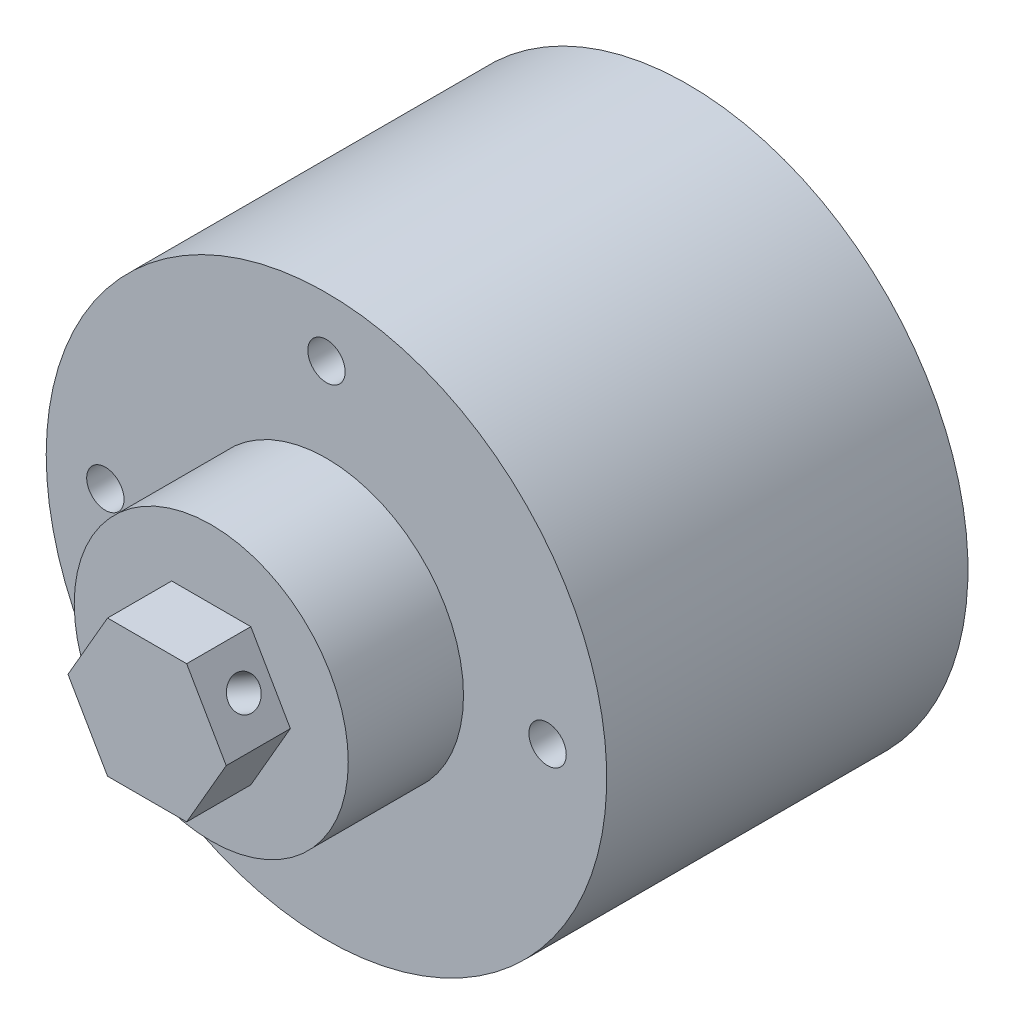
ISO-10303-21;
HEADER;
FILE_DESCRIPTION(('STEP AP214'),'2;1');
FILE_NAME('part.step','',(''),(''),'','','');
FILE_SCHEMA(('AUTOMOTIVE_DESIGN { 1 0 10303 214 1 1 1 1 }'));
ENDSEC;
DATA;
#1=APPLICATION_CONTEXT('core data for automotive mechanical design processes');
#2=APPLICATION_PROTOCOL_DEFINITION('international standard','automotive_design',2000,#1);
#3=PRODUCT_CONTEXT('',#1,'mechanical');
#4=PRODUCT('Part','Part','',(#3));
#5=PRODUCT_RELATED_PRODUCT_CATEGORY('part','',(#4));
#6=PRODUCT_DEFINITION_FORMATION('','',#4);
#7=PRODUCT_DEFINITION_CONTEXT('part definition',#1,'design');
#8=PRODUCT_DEFINITION('design','',#6,#7);
#9=PRODUCT_DEFINITION_SHAPE('','',#8);
#10=(LENGTH_UNIT() NAMED_UNIT(*) SI_UNIT(.MILLI.,.METRE.));
#11=(NAMED_UNIT(*) PLANE_ANGLE_UNIT() SI_UNIT($,.RADIAN.));
#12=(NAMED_UNIT(*) SI_UNIT($,.STERADIAN.) SOLID_ANGLE_UNIT());
#13=UNCERTAINTY_MEASURE_WITH_UNIT(LENGTH_MEASURE(1.E-05),#10,'distance_accuracy_value','');
#14=(GEOMETRIC_REPRESENTATION_CONTEXT(3) GLOBAL_UNCERTAINTY_ASSIGNED_CONTEXT((#13)) GLOBAL_UNIT_ASSIGNED_CONTEXT((#10,
#11,#12)) REPRESENTATION_CONTEXT('',''));
#15=CARTESIAN_POINT('',(0.,0.,0.));
#16=DIRECTION('',(0.,0.,1.));
#17=DIRECTION('',(1.,0.,0.));
#18=AXIS2_PLACEMENT_3D('',#15,#16,#17);
#19=CARTESIAN_POINT('',(0.,0.,58.));
#20=DIRECTION('',(0.,0.,-1.));
#21=DIRECTION('',(-1.,0.,0.));
#22=AXIS2_PLACEMENT_3D('',#19,#20,#21);
#23=CYLINDRICAL_SURFACE('',#22,45.);
#24=CARTESIAN_POINT('',(0.,0.,58.));
#25=DIRECTION('',(0.,0.,1.));
#26=DIRECTION('',(1.,0.,0.));
#27=AXIS2_PLACEMENT_3D('',#24,#25,#26);
#28=CIRCLE('',#27,45.);
#29=CARTESIAN_POINT('',(-45.,0.,58.));
#30=VERTEX_POINT('',#29);
#31=EDGE_CURVE('E54',#30,#30,#28,.T.);
#32=CARTESIAN_POINT('',(0.,0.,0.));
#33=DIRECTION('',(0.,0.,1.));
#34=DIRECTION('',(1.,0.,0.));
#35=AXIS2_PLACEMENT_3D('',#32,#33,#34);
#36=CIRCLE('',#35,45.);
#37=CARTESIAN_POINT('',(-45.,0.,0.));
#38=VERTEX_POINT('',#37);
#39=EDGE_CURVE('E128',#38,#38,#36,.T.);
#40=CARTESIAN_POINT('',(-45.,0.,58.));
#41=CARTESIAN_POINT('',(-45.,0.,57.3958333333333));
#42=CARTESIAN_POINT('',(-45.,0.,56.7916666666667));
#43=CARTESIAN_POINT('',(-45.,0.,55.5833333333333));
#44=CARTESIAN_POINT('',(-45.,0.,54.9791666666667));
#45=CARTESIAN_POINT('',(-45.,0.,53.7708333333333));
#46=CARTESIAN_POINT('',(-45.,0.,53.1666666666667));
#47=CARTESIAN_POINT('',(-45.,0.,51.9583333333333));
#48=CARTESIAN_POINT('',(-45.,0.,51.3541666666667));
#49=CARTESIAN_POINT('',(-45.,0.,50.1458333333333));
#50=CARTESIAN_POINT('',(-45.,0.,49.5416666666667));
#51=CARTESIAN_POINT('',(-45.,0.,48.3333333333333));
#52=CARTESIAN_POINT('',(-45.,0.,47.7291666666667));
#53=CARTESIAN_POINT('',(-45.,0.,46.5208333333333));
#54=CARTESIAN_POINT('',(-45.,0.,45.9166666666667));
#55=CARTESIAN_POINT('',(-45.,0.,44.7083333333333));
#56=CARTESIAN_POINT('',(-45.,0.,44.1041666666667));
#57=CARTESIAN_POINT('',(-45.,0.,42.8958333333333));
#58=CARTESIAN_POINT('',(-45.,0.,42.2916666666667));
#59=CARTESIAN_POINT('',(-45.,0.,41.0833333333333));
#60=CARTESIAN_POINT('',(-45.,0.,40.4791666666667));
#61=CARTESIAN_POINT('',(-45.,0.,39.2708333333333));
#62=CARTESIAN_POINT('',(-45.,0.,38.6666666666667));
#63=CARTESIAN_POINT('',(-45.,0.,37.4583333333333));
#64=CARTESIAN_POINT('',(-45.,0.,36.8541666666667));
#65=CARTESIAN_POINT('',(-45.,0.,35.6458333333333));
#66=CARTESIAN_POINT('',(-45.,0.,35.0416666666667));
#67=CARTESIAN_POINT('',(-45.,0.,33.8333333333333));
#68=CARTESIAN_POINT('',(-45.,0.,33.2291666666667));
#69=CARTESIAN_POINT('',(-45.,0.,32.0208333333333));
#70=CARTESIAN_POINT('',(-45.,0.,31.4166666666667));
#71=CARTESIAN_POINT('',(-45.,0.,30.2083333333333));
#72=CARTESIAN_POINT('',(-45.,0.,29.6041666666667));
#73=CARTESIAN_POINT('',(-45.,0.,28.3958333333333));
#74=CARTESIAN_POINT('',(-45.,0.,27.7916666666667));
#75=CARTESIAN_POINT('',(-45.,0.,26.5833333333333));
#76=CARTESIAN_POINT('',(-45.,0.,25.9791666666667));
#77=CARTESIAN_POINT('',(-45.,0.,24.7708333333333));
#78=CARTESIAN_POINT('',(-45.,0.,24.1666666666667));
#79=CARTESIAN_POINT('',(-45.,0.,22.9583333333333));
#80=CARTESIAN_POINT('',(-45.,0.,22.3541666666667));
#81=CARTESIAN_POINT('',(-45.,0.,21.1458333333333));
#82=CARTESIAN_POINT('',(-45.,0.,20.5416666666667));
#83=CARTESIAN_POINT('',(-45.,0.,19.3333333333333));
#84=CARTESIAN_POINT('',(-45.,0.,18.7291666666667));
#85=CARTESIAN_POINT('',(-45.,0.,17.5208333333333));
#86=CARTESIAN_POINT('',(-45.,0.,16.9166666666667));
#87=CARTESIAN_POINT('',(-45.,0.,15.7083333333333));
#88=CARTESIAN_POINT('',(-45.,0.,15.1041666666667));
#89=CARTESIAN_POINT('',(-45.,0.,13.8958333333333));
#90=CARTESIAN_POINT('',(-45.,0.,13.2916666666667));
#91=CARTESIAN_POINT('',(-45.,0.,12.0833333333333));
#92=CARTESIAN_POINT('',(-45.,0.,11.4791666666667));
#93=CARTESIAN_POINT('',(-45.,0.,10.2708333333333));
#94=CARTESIAN_POINT('',(-45.,0.,9.66666666666667));
#95=CARTESIAN_POINT('',(-45.,0.,8.45833333333333));
#96=CARTESIAN_POINT('',(-45.,0.,7.85416666666667));
#97=CARTESIAN_POINT('',(-45.,0.,6.64583333333333));
#98=CARTESIAN_POINT('',(-45.,0.,6.04166666666667));
#99=CARTESIAN_POINT('',(-45.,0.,4.83333333333333));
#100=CARTESIAN_POINT('',(-45.,0.,4.22916666666667));
#101=CARTESIAN_POINT('',(-45.,0.,3.02083333333334));
#102=CARTESIAN_POINT('',(-45.,0.,2.41666666666667));
#103=CARTESIAN_POINT('',(-45.,0.,1.20833333333333));
#104=CARTESIAN_POINT('',(-45.,0.,0.604166666666666));
#105=CARTESIAN_POINT('',(-45.,0.,0.));
#106=B_SPLINE_CURVE_WITH_KNOTS('',3,(#40,#41,#42,#43,#44,#45,#46,#47,#48,#49,#50,#51,#52,#53,
#54,#55,#56,#57,#58,#59,#60,#61,#62,#63,#64,#65,#66,#67,#68,#69,#70,#71,#72,#73,#74,#75,#76,#77,
#78,#79,#80,#81,#82,#83,#84,#85,#86,#87,#88,#89,#90,#91,#92,#93,#94,#95,#96,#97,#98,#99,#100,
#101,#102,#103,#104,#105),.UNSPECIFIED.,.F.,.F.,(4,2,2,2,2,2,2,2,2,2,2,2,2,2,2,2,2,2,2,2,2,2,2,
2,2,2,2,2,2,2,2,2,4),(0.,1.81249999999999,3.625,5.4375,7.24999999999999,9.06249999999999,10.875,
12.6875,14.5,16.3125,18.125,19.9375,21.75,23.5625,25.375,27.1875,29.,30.8125,32.625,34.4375,
36.25,38.0625,39.875,41.6875,43.5,45.3125,47.125,48.9375,50.75,52.5625,54.375,56.1875,58.),.UNSPECIFIED.);
#107=EDGE_CURVE('BSEAM45',#30,#38,#106,.T.);
#108=ORIENTED_EDGE('',*,*,#31,.F.);
#109=ORIENTED_EDGE('',*,*,#39,.T.);
#110=ORIENTED_EDGE('',*,*,#107,.T.);
#111=ORIENTED_EDGE('',*,*,#107,.F.);
#112=EDGE_LOOP('',(#108,#110,#109,#111));
#113=FACE_BOUND('',#112,.T.);
#114=ADVANCED_FACE('F45',(#113),#23,.T.);
#115=CARTESIAN_POINT('',(0.,0.,58.));
#116=DIRECTION('',(0.,0.,1.));
#117=DIRECTION('',(1.,0.,0.));
#118=AXIS2_PLACEMENT_3D('',#115,#116,#117);
#119=PLANE('',#118);
#120=CARTESIAN_POINT('',(-35.5,0.,58.));
#121=DIRECTION('',(0.,0.,1.));
#122=DIRECTION('',(1.,0.,0.));
#123=AXIS2_PLACEMENT_3D('',#120,#121,#122);
#124=CIRCLE('',#123,3.);
#125=CARTESIAN_POINT('',(-32.5,0.,58.));
#126=VERTEX_POINT('',#125);
#127=EDGE_CURVE('E328',#126,#126,#124,.T.);
#128=ORIENTED_EDGE('',*,*,#127,.F.);
#129=EDGE_LOOP('',(#128));
#130=FACE_BOUND('',#129,.T.);
#131=CARTESIAN_POINT('',(35.5,0.,58.));
#132=DIRECTION('',(0.,0.,1.));
#133=DIRECTION('',(1.,0.,0.));
#134=AXIS2_PLACEMENT_3D('',#131,#132,#133);
#135=CIRCLE('',#134,3.);
#136=CARTESIAN_POINT('',(38.5,0.,58.));
#137=VERTEX_POINT('',#136);
#138=EDGE_CURVE('E335',#137,#137,#135,.T.);
#139=ORIENTED_EDGE('',*,*,#138,.F.);
#140=EDGE_LOOP('',(#139));
#141=FACE_BOUND('',#140,.T.);
#142=CARTESIAN_POINT('',(0.,35.5,58.));
#143=DIRECTION('',(0.,0.,1.));
#144=DIRECTION('',(1.,0.,0.));
#145=AXIS2_PLACEMENT_3D('',#142,#143,#144);
#146=CIRCLE('',#145,3.);
#147=CARTESIAN_POINT('',(3.,35.5,58.));
#148=VERTEX_POINT('',#147);
#149=EDGE_CURVE('E345',#148,#148,#146,.T.);
#150=ORIENTED_EDGE('',*,*,#149,.F.);
#151=EDGE_LOOP('',(#150));
#152=FACE_BOUND('',#151,.T.);
#153=CARTESIAN_POINT('',(0.,0.,58.));
#154=DIRECTION('',(0.,0.,1.));
#155=DIRECTION('',(1.,0.,0.));
#156=AXIS2_PLACEMENT_3D('',#153,#154,#155);
#157=CIRCLE('',#156,22.);
#158=CARTESIAN_POINT('',(22.,0.,58.));
#159=VERTEX_POINT('',#158);
#160=EDGE_CURVE('E11',#159,#159,#157,.T.);
#161=ORIENTED_EDGE('',*,*,#160,.F.);
#162=EDGE_LOOP('',(#161));
#163=FACE_BOUND('',#162,.T.);
#164=ORIENTED_EDGE('',*,*,#31,.T.);
#165=EDGE_LOOP('',(#164));
#166=FACE_BOUND('',#165,.T.);
#167=ADVANCED_FACE('F144',(#130,#141,#152,#163,#166),#119,.T.);
#168=CARTESIAN_POINT('',(0.,0.,0.));
#169=DIRECTION('',(0.,0.,1.));
#170=DIRECTION('',(1.,0.,0.));
#171=AXIS2_PLACEMENT_3D('',#168,#169,#170);
#172=PLANE('',#171);
#173=ORIENTED_EDGE('',*,*,#39,.F.);
#174=EDGE_LOOP('',(#173));
#175=FACE_BOUND('',#174,.T.);
#176=ADVANCED_FACE('F141',(#175),#172,.F.);
#177=CARTESIAN_POINT('',(0.,0.,76.5));
#178=DIRECTION('',(0.,0.,-1.));
#179=DIRECTION('',(-1.,0.,0.));
#180=AXIS2_PLACEMENT_3D('',#177,#178,#179);
#181=CYLINDRICAL_SURFACE('',#180,22.);
#182=CARTESIAN_POINT('',(0.,0.,76.5));
#183=DIRECTION('',(0.,0.,1.));
#184=DIRECTION('',(1.,0.,0.));
#185=AXIS2_PLACEMENT_3D('',#182,#183,#184);
#186=CIRCLE('',#185,22.);
#187=CARTESIAN_POINT('',(22.,0.,76.5));
#188=VERTEX_POINT('',#187);
#189=EDGE_CURVE('E123',#188,#188,#186,.T.);
#190=ORIENTED_EDGE('',*,*,#189,.F.);
#191=EDGE_LOOP('',(#190));
#192=FACE_BOUND('',#191,.T.);
#193=ORIENTED_EDGE('',*,*,#160,.T.);
#194=EDGE_LOOP('',(#193));
#195=FACE_BOUND('',#194,.T.);
#196=ADVANCED_FACE('F143',(#192,#195),#181,.T.);
#197=CARTESIAN_POINT('',(0.,0.,76.5));
#198=DIRECTION('',(0.,0.,1.));
#199=DIRECTION('',(1.,0.,0.));
#200=AXIS2_PLACEMENT_3D('',#197,#198,#199);
#201=PLANE('',#200);
#202=DIRECTION('',(0.5,0.866025403784439,0.));
#203=VECTOR('',#202,1.);
#204=CARTESIAN_POINT('',(6.35085296108589,-11.,76.5));
#205=LINE('',#204,#203);
#206=CARTESIAN_POINT('',(6.35085296108589,-11.,76.5));
#207=VERTEX_POINT('',#206);
#208=CARTESIAN_POINT('',(12.7017059221718,0.,76.5));
#209=VERTEX_POINT('',#208);
#210=EDGE_CURVE('E62',#207,#209,#205,.T.);
#211=ORIENTED_EDGE('',*,*,#210,.F.);
#212=DIRECTION('',(1.,0.,0.));
#213=VECTOR('',#212,1.);
#214=CARTESIAN_POINT('',(-6.35085296108588,-11.,76.5));
#215=LINE('',#214,#213);
#216=CARTESIAN_POINT('',(-6.35085296108588,-11.,76.5));
#217=VERTEX_POINT('',#216);
#218=EDGE_CURVE('E66',#217,#207,#215,.T.);
#219=ORIENTED_EDGE('',*,*,#218,.F.);
#220=DIRECTION('',(0.5,-0.866025403784438,0.));
#221=VECTOR('',#220,1.);
#222=CARTESIAN_POINT('',(-12.7017059221718,0.,76.5));
#223=LINE('',#222,#221);
#224=CARTESIAN_POINT('',(-12.7017059221718,0.,76.5));
#225=VERTEX_POINT('',#224);
#226=EDGE_CURVE('E377',#225,#217,#223,.T.);
#227=ORIENTED_EDGE('',*,*,#226,.F.);
#228=DIRECTION('',(-0.5,-0.866025403784439,0.));
#229=VECTOR('',#228,1.);
#230=CARTESIAN_POINT('',(-6.35085296108588,11.,76.5));
#231=LINE('',#230,#229);
#232=CARTESIAN_POINT('',(-6.35085296108588,11.,76.5));
#233=VERTEX_POINT('',#232);
#234=EDGE_CURVE('E373',#233,#225,#231,.T.);
#235=ORIENTED_EDGE('',*,*,#234,.F.);
#236=DIRECTION('',(-1.,0.,0.));
#237=VECTOR('',#236,1.);
#238=CARTESIAN_POINT('',(6.35085296108588,11.,76.5));
#239=LINE('',#238,#237);
#240=CARTESIAN_POINT('',(6.35085296108588,11.,76.5));
#241=VERTEX_POINT('',#240);
#242=EDGE_CURVE('E369',#241,#233,#239,.T.);
#243=ORIENTED_EDGE('',*,*,#242,.F.);
#244=DIRECTION('',(-0.5,0.866025403784438,0.));
#245=VECTOR('',#244,1.);
#246=CARTESIAN_POINT('',(12.7017059221718,0.,76.5));
#247=LINE('',#246,#245);
#248=EDGE_CURVE('E366',#209,#241,#247,.T.);
#249=ORIENTED_EDGE('',*,*,#248,.F.);
#250=EDGE_LOOP('',(#211,#219,#227,#235,#243,#249));
#251=FACE_BOUND('',#250,.T.);
#252=ORIENTED_EDGE('',*,*,#189,.T.);
#253=EDGE_LOOP('',(#252));
#254=FACE_BOUND('',#253,.T.);
#255=ADVANCED_FACE('F149',(#251,#254),#201,.T.);
#256=CARTESIAN_POINT('',(6.35085296108589,-11.,86.8));
#257=DIRECTION('',(-0.866025403784439,0.5,0.));
#258=DIRECTION('',(-0.5,-0.866025403784439,0.));
#259=AXIS2_PLACEMENT_3D('',#256,#257,#258);
#260=PLANE('',#259);
#261=ORIENTED_EDGE('',*,*,#210,.T.);
#262=DIRECTION('',(0.,0.,-1.));
#263=VECTOR('',#262,1.);
#264=CARTESIAN_POINT('',(12.7017059221718,0.,86.8));
#265=LINE('',#264,#263);
#266=CARTESIAN_POINT('',(12.7017059221718,0.,86.8));
#267=VERTEX_POINT('',#266);
#268=EDGE_CURVE('E103',#267,#209,#265,.T.);
#269=ORIENTED_EDGE('',*,*,#268,.F.);
#270=DIRECTION('',(0.5,0.866025403784439,0.));
#271=VECTOR('',#270,1.);
#272=CARTESIAN_POINT('',(6.35085296108589,-11.,86.8));
#273=LINE('',#272,#271);
#274=CARTESIAN_POINT('',(6.35085296108589,-11.,86.8));
#275=VERTEX_POINT('',#274);
#276=EDGE_CURVE('E110',#275,#267,#273,.T.);
#277=ORIENTED_EDGE('',*,*,#276,.F.);
#278=DIRECTION('',(0.,0.,-1.));
#279=VECTOR('',#278,1.);
#280=CARTESIAN_POINT('',(6.35085296108589,-11.,86.8));
#281=LINE('',#280,#279);
#282=EDGE_CURVE('E363',#275,#207,#281,.T.);
#283=ORIENTED_EDGE('',*,*,#282,.T.);
#284=EDGE_LOOP('',(#261,#269,#277,#283));
#285=FACE_BOUND('',#284,.T.);
#286=ADVANCED_FACE('F121',(#285),#260,.F.);
#287=CARTESIAN_POINT('',(12.7017059221718,0.,86.8));
#288=DIRECTION('',(-0.866025403784438,-0.5,0.));
#289=DIRECTION('',(0.5,-0.866025403784439,0.));
#290=AXIS2_PLACEMENT_3D('',#287,#288,#289);
#291=PLANE('',#290);
#292=CARTESIAN_POINT('',(9.52627944162883,5.50000000000001,80.8));
#293=DIRECTION('',(0.866025403784438,0.5,0.));
#294=DIRECTION('',(-0.5,0.866025403784439,0.));
#295=AXIS2_PLACEMENT_3D('',#292,#293,#294);
#296=CIRCLE('',#295,2.49999999999999);
#297=CARTESIAN_POINT('',(8.27627944162883,7.6650635094611,80.8));
#298=VERTEX_POINT('',#297);
#299=EDGE_CURVE('E327',#298,#298,#296,.T.);
#300=ORIENTED_EDGE('',*,*,#299,.F.);
#301=EDGE_LOOP('',(#300));
#302=FACE_BOUND('',#301,.T.);
#303=ORIENTED_EDGE('',*,*,#248,.T.);
#304=DIRECTION('',(0.,0.,-1.));
#305=VECTOR('',#304,1.);
#306=CARTESIAN_POINT('',(6.35085296108588,11.,86.8));
#307=LINE('',#306,#305);
#308=CARTESIAN_POINT('',(6.35085296108588,11.,86.8));
#309=VERTEX_POINT('',#308);
#310=EDGE_CURVE('E105',#309,#241,#307,.T.);
#311=ORIENTED_EDGE('',*,*,#310,.F.);
#312=DIRECTION('',(-0.5,0.866025403784438,0.));
#313=VECTOR('',#312,1.);
#314=CARTESIAN_POINT('',(12.7017059221718,0.,86.8));
#315=LINE('',#314,#313);
#316=EDGE_CURVE('E98',#267,#309,#315,.T.);
#317=ORIENTED_EDGE('',*,*,#316,.F.);
#318=ORIENTED_EDGE('',*,*,#268,.T.);
#319=EDGE_LOOP('',(#303,#311,#317,#318));
#320=FACE_BOUND('',#319,.T.);
#321=ADVANCED_FACE('F101',(#302,#320),#291,.F.);
#322=CARTESIAN_POINT('',(6.35085296108588,11.,86.8));
#323=DIRECTION('',(0.,-1.,0.));
#324=DIRECTION('',(0.,0.,-1.));
#325=AXIS2_PLACEMENT_3D('',#322,#323,#324);
#326=PLANE('',#325);
#327=ORIENTED_EDGE('',*,*,#242,.T.);
#328=DIRECTION('',(0.,0.,-1.));
#329=VECTOR('',#328,1.);
#330=CARTESIAN_POINT('',(-6.35085296108588,11.,86.8));
#331=LINE('',#330,#329);
#332=CARTESIAN_POINT('',(-6.35085296108588,11.,86.8));
#333=VERTEX_POINT('',#332);
#334=EDGE_CURVE('E130',#333,#233,#331,.T.);
#335=ORIENTED_EDGE('',*,*,#334,.F.);
#336=DIRECTION('',(-1.,0.,0.));
#337=VECTOR('',#336,1.);
#338=CARTESIAN_POINT('',(6.35085296108588,11.,86.8));
#339=LINE('',#338,#337);
#340=EDGE_CURVE('E109',#309,#333,#339,.T.);
#341=ORIENTED_EDGE('',*,*,#340,.F.);
#342=ORIENTED_EDGE('',*,*,#310,.T.);
#343=EDGE_LOOP('',(#327,#335,#341,#342));
#344=FACE_BOUND('',#343,.T.);
#345=ADVANCED_FACE('F205',(#344),#326,.F.);
#346=CARTESIAN_POINT('',(-6.35085296108588,11.,86.8));
#347=DIRECTION('',(0.866025403784439,-0.5,0.));
#348=DIRECTION('',(0.5,0.866025403784439,0.));
#349=AXIS2_PLACEMENT_3D('',#346,#347,#348);
#350=PLANE('',#349);
#351=ORIENTED_EDGE('',*,*,#234,.T.);
#352=DIRECTION('',(0.,0.,-1.));
#353=VECTOR('',#352,1.);
#354=CARTESIAN_POINT('',(-12.7017059221718,0.,86.8));
#355=LINE('',#354,#353);
#356=CARTESIAN_POINT('',(-12.7017059221718,0.,86.8));
#357=VERTEX_POINT('',#356);
#358=EDGE_CURVE('E388',#357,#225,#355,.T.);
#359=ORIENTED_EDGE('',*,*,#358,.F.);
#360=DIRECTION('',(-0.5,-0.866025403784439,0.));
#361=VECTOR('',#360,1.);
#362=CARTESIAN_POINT('',(-6.35085296108588,11.,86.8));
#363=LINE('',#362,#361);
#364=EDGE_CURVE('E355',#333,#357,#363,.T.);
#365=ORIENTED_EDGE('',*,*,#364,.F.);
#366=ORIENTED_EDGE('',*,*,#334,.T.);
#367=EDGE_LOOP('',(#351,#359,#365,#366));
#368=FACE_BOUND('',#367,.T.);
#369=ADVANCED_FACE('F216',(#368),#350,.F.);
#370=CARTESIAN_POINT('',(-12.7017059221718,0.,86.8));
#371=DIRECTION('',(0.866025403784439,0.5,0.));
#372=DIRECTION('',(-0.5,0.866025403784438,0.));
#373=AXIS2_PLACEMENT_3D('',#370,#371,#372);
#374=PLANE('',#373);
#375=CARTESIAN_POINT('',(-9.52627944162882,-5.5,80.8));
#376=DIRECTION('',(0.866025403784439,0.5,0.));
#377=DIRECTION('',(-0.5,0.866025403784438,0.));
#378=AXIS2_PLACEMENT_3D('',#375,#376,#377);
#379=CIRCLE('',#378,2.49999999999999);
#380=CARTESIAN_POINT('',(-10.7762794416288,-3.33493649053891,80.8));
#381=VERTEX_POINT('',#380);
#382=EDGE_CURVE('E48',#381,#381,#379,.T.);
#383=ORIENTED_EDGE('',*,*,#382,.T.);
#384=EDGE_LOOP('',(#383));
#385=FACE_BOUND('',#384,.T.);
#386=ORIENTED_EDGE('',*,*,#226,.T.);
#387=DIRECTION('',(0.,0.,-1.));
#388=VECTOR('',#387,1.);
#389=CARTESIAN_POINT('',(-6.35085296108588,-11.,86.8));
#390=LINE('',#389,#388);
#391=CARTESIAN_POINT('',(-6.35085296108588,-11.,86.8));
#392=VERTEX_POINT('',#391);
#393=EDGE_CURVE('E384',#392,#217,#390,.T.);
#394=ORIENTED_EDGE('',*,*,#393,.F.);
#395=DIRECTION('',(0.5,-0.866025403784438,0.));
#396=VECTOR('',#395,1.);
#397=CARTESIAN_POINT('',(-12.7017059221718,0.,86.8));
#398=LINE('',#397,#396);
#399=EDGE_CURVE('E358',#357,#392,#398,.T.);
#400=ORIENTED_EDGE('',*,*,#399,.F.);
#401=ORIENTED_EDGE('',*,*,#358,.T.);
#402=EDGE_LOOP('',(#386,#394,#400,#401));
#403=FACE_BOUND('',#402,.T.);
#404=ADVANCED_FACE('F226',(#385,#403),#374,.F.);
#405=CARTESIAN_POINT('',(-6.35085296108588,-11.,86.8));
#406=DIRECTION('',(0.,1.,0.));
#407=DIRECTION('',(-1.,0.,0.));
#408=AXIS2_PLACEMENT_3D('',#405,#406,#407);
#409=PLANE('',#408);
#410=ORIENTED_EDGE('',*,*,#218,.T.);
#411=ORIENTED_EDGE('',*,*,#282,.F.);
#412=DIRECTION('',(1.,0.,0.));
#413=VECTOR('',#412,1.);
#414=CARTESIAN_POINT('',(-6.35085296108588,-11.,86.8));
#415=LINE('',#414,#413);
#416=EDGE_CURVE('E115',#392,#275,#415,.T.);
#417=ORIENTED_EDGE('',*,*,#416,.F.);
#418=ORIENTED_EDGE('',*,*,#393,.T.);
#419=EDGE_LOOP('',(#410,#411,#417,#418));
#420=FACE_BOUND('',#419,.T.);
#421=ADVANCED_FACE('F236',(#420),#409,.F.);
#422=CARTESIAN_POINT('',(0.,0.,86.8));
#423=DIRECTION('',(0.,0.,1.));
#424=DIRECTION('',(1.,0.,0.));
#425=AXIS2_PLACEMENT_3D('',#422,#423,#424);
#426=PLANE('',#425);
#427=ORIENTED_EDGE('',*,*,#276,.T.);
#428=ORIENTED_EDGE('',*,*,#316,.T.);
#429=ORIENTED_EDGE('',*,*,#340,.T.);
#430=ORIENTED_EDGE('',*,*,#364,.T.);
#431=ORIENTED_EDGE('',*,*,#399,.T.);
#432=ORIENTED_EDGE('',*,*,#416,.T.);
#433=EDGE_LOOP('',(#427,#428,#429,#430,#431,#432));
#434=FACE_BOUND('',#433,.T.);
#435=ADVANCED_FACE('F113',(#434),#426,.T.);
#436=CARTESIAN_POINT('',(-53.2355715851499,-30.7355715851499,80.8));
#437=DIRECTION('',(0.866025403784438,0.5,0.));
#438=DIRECTION('',(-0.5,0.866025403784438,0.));
#439=AXIS2_PLACEMENT_3D('',#436,#437,#438);
#440=CYLINDRICAL_SURFACE('',#439,2.49999999999999);
#441=ORIENTED_EDGE('',*,*,#299,.T.);
#442=EDGE_LOOP('',(#441));
#443=FACE_BOUND('',#442,.T.);
#444=ORIENTED_EDGE('',*,*,#382,.F.);
#445=EDGE_LOOP('',(#444));
#446=FACE_BOUND('',#445,.T.);
#447=ADVANCED_FACE('F253',(#443,#446),#440,.F.);
#448=CARTESIAN_POINT('',(0.,35.5,48.));
#449=DIRECTION('',(0.,0.,1.));
#450=DIRECTION('',(1.,0.,0.));
#451=AXIS2_PLACEMENT_3D('',#448,#449,#450);
#452=CYLINDRICAL_SURFACE('',#451,3.);
#453=CARTESIAN_POINT('',(0.,35.5,48.));
#454=DIRECTION('',(0.,0.,1.));
#455=DIRECTION('',(1.,0.,0.));
#456=AXIS2_PLACEMENT_3D('',#453,#454,#455);
#457=CIRCLE('',#456,3.);
#458=CARTESIAN_POINT('',(3.,35.5,48.));
#459=VERTEX_POINT('',#458);
#460=EDGE_CURVE('E349',#459,#459,#457,.T.);
#461=ORIENTED_EDGE('',*,*,#460,.F.);
#462=EDGE_LOOP('',(#461));
#463=FACE_BOUND('',#462,.T.);
#464=ORIENTED_EDGE('',*,*,#149,.T.);
#465=EDGE_LOOP('',(#464));
#466=FACE_BOUND('',#465,.T.);
#467=ADVANCED_FACE('F261',(#463,#466),#452,.F.);
#468=CARTESIAN_POINT('',(0.,35.5,48.));
#469=DIRECTION('',(0.,0.,1.));
#470=DIRECTION('',(1.,0.,0.));
#471=AXIS2_PLACEMENT_3D('',#468,#469,#470);
#472=PLANE('',#471);
#473=ORIENTED_EDGE('',*,*,#460,.T.);
#474=EDGE_LOOP('',(#473));
#475=FACE_BOUND('',#474,.T.);
#476=ADVANCED_FACE('F270',(#475),#472,.T.);
#477=CARTESIAN_POINT('',(35.5,0.,48.));
#478=DIRECTION('',(0.,0.,1.));
#479=DIRECTION('',(1.,0.,0.));
#480=AXIS2_PLACEMENT_3D('',#477,#478,#479);
#481=CYLINDRICAL_SURFACE('',#480,3.);
#482=CARTESIAN_POINT('',(35.5,0.,48.));
#483=DIRECTION('',(0.,0.,1.));
#484=DIRECTION('',(1.,0.,0.));
#485=AXIS2_PLACEMENT_3D('',#482,#483,#484);
#486=CIRCLE('',#485,3.);
#487=CARTESIAN_POINT('',(38.5,0.,48.));
#488=VERTEX_POINT('',#487);
#489=EDGE_CURVE('E341',#488,#488,#486,.T.);
#490=ORIENTED_EDGE('',*,*,#489,.F.);
#491=EDGE_LOOP('',(#490));
#492=FACE_BOUND('',#491,.T.);
#493=ORIENTED_EDGE('',*,*,#138,.T.);
#494=EDGE_LOOP('',(#493));
#495=FACE_BOUND('',#494,.T.);
#496=ADVANCED_FACE('F280',(#492,#495),#481,.F.);
#497=CARTESIAN_POINT('',(35.5,0.,48.));
#498=DIRECTION('',(0.,0.,1.));
#499=DIRECTION('',(1.,0.,0.));
#500=AXIS2_PLACEMENT_3D('',#497,#498,#499);
#501=PLANE('',#500);
#502=ORIENTED_EDGE('',*,*,#489,.T.);
#503=EDGE_LOOP('',(#502));
#504=FACE_BOUND('',#503,.T.);
#505=ADVANCED_FACE('F290',(#504),#501,.T.);
#506=CARTESIAN_POINT('',(-35.5,0.,48.));
#507=DIRECTION('',(0.,0.,1.));
#508=DIRECTION('',(1.,0.,0.));
#509=AXIS2_PLACEMENT_3D('',#506,#507,#508);
#510=CYLINDRICAL_SURFACE('',#509,3.);
#511=CARTESIAN_POINT('',(-35.5,0.,48.));
#512=DIRECTION('',(0.,0.,1.));
#513=DIRECTION('',(1.,0.,0.));
#514=AXIS2_PLACEMENT_3D('',#511,#512,#513);
#515=CIRCLE('',#514,3.);
#516=CARTESIAN_POINT('',(-32.5,0.,48.));
#517=VERTEX_POINT('',#516);
#518=EDGE_CURVE('E325',#517,#517,#515,.T.);
#519=ORIENTED_EDGE('',*,*,#518,.F.);
#520=EDGE_LOOP('',(#519));
#521=FACE_BOUND('',#520,.T.);
#522=ORIENTED_EDGE('',*,*,#127,.T.);
#523=EDGE_LOOP('',(#522));
#524=FACE_BOUND('',#523,.T.);
#525=ADVANCED_FACE('F300',(#521,#524),#510,.F.);
#526=CARTESIAN_POINT('',(-35.5,0.,48.));
#527=DIRECTION('',(0.,0.,1.));
#528=DIRECTION('',(1.,0.,0.));
#529=AXIS2_PLACEMENT_3D('',#526,#527,#528);
#530=PLANE('',#529);
#531=ORIENTED_EDGE('',*,*,#518,.T.);
#532=EDGE_LOOP('',(#531));
#533=FACE_BOUND('',#532,.T.);
#534=ADVANCED_FACE('F310',(#533),#530,.T.);
#535=CLOSED_SHELL('',(#114,#167,#176,#196,#255,#286,#321,#345,#369,#404,#421,#435,#447,#467,
#476,#496,#505,#525,#534));
#536=MANIFOLD_SOLID_BREP('B2',#535);
#537=ADVANCED_BREP_SHAPE_REPRESENTATION('',(#18,#536),#14);
#538=SHAPE_DEFINITION_REPRESENTATION(#9,#537);
ENDSEC;
END-ISO-10303-21;
